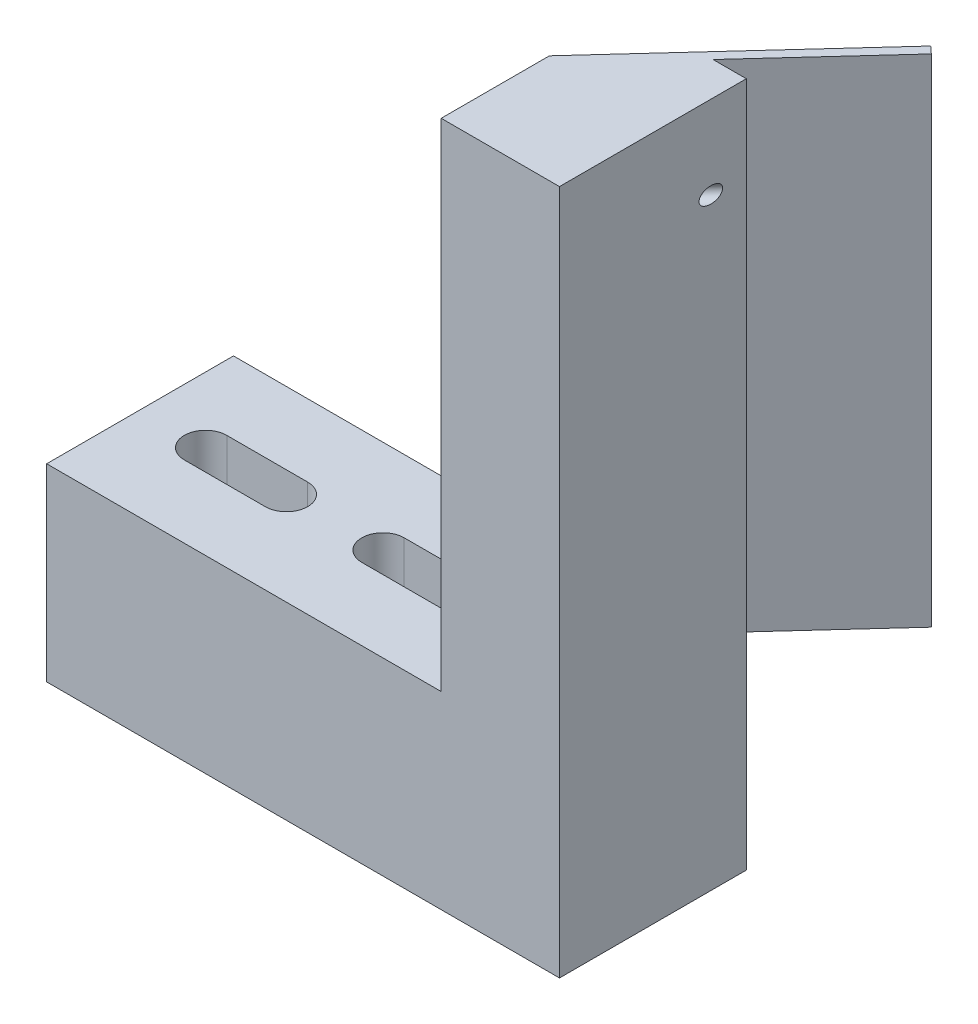
ISO-10303-21;
HEADER;
FILE_DESCRIPTION(('STEP AP214'),'2;1');
FILE_NAME('part.step','',(''),(''),'','','');
FILE_SCHEMA(('AUTOMOTIVE_DESIGN { 1 0 10303 214 1 1 1 1 }'));
ENDSEC;
DATA;
#1=APPLICATION_CONTEXT('core data for automotive mechanical design processes');
#2=APPLICATION_PROTOCOL_DEFINITION('international standard','automotive_design',2000,#1);
#3=PRODUCT_CONTEXT('',#1,'mechanical');
#4=PRODUCT('Part','Part','',(#3));
#5=PRODUCT_RELATED_PRODUCT_CATEGORY('part','',(#4));
#6=PRODUCT_DEFINITION_FORMATION('','',#4);
#7=PRODUCT_DEFINITION_CONTEXT('part definition',#1,'design');
#8=PRODUCT_DEFINITION('design','',#6,#7);
#9=PRODUCT_DEFINITION_SHAPE('','',#8);
#10=(LENGTH_UNIT() NAMED_UNIT(*) SI_UNIT(.MILLI.,.METRE.));
#11=(NAMED_UNIT(*) PLANE_ANGLE_UNIT() SI_UNIT($,.RADIAN.));
#12=(NAMED_UNIT(*) SI_UNIT($,.STERADIAN.) SOLID_ANGLE_UNIT());
#13=UNCERTAINTY_MEASURE_WITH_UNIT(LENGTH_MEASURE(1.E-05),#10,'distance_accuracy_value','');
#14=(GEOMETRIC_REPRESENTATION_CONTEXT(3) GLOBAL_UNCERTAINTY_ASSIGNED_CONTEXT((#13)) GLOBAL_UNIT_ASSIGNED_CONTEXT((#10,
#11,#12)) REPRESENTATION_CONTEXT('',''));
#15=CARTESIAN_POINT('',(0.,0.,0.));
#16=DIRECTION('',(0.,0.,1.));
#17=DIRECTION('',(1.,0.,0.));
#18=AXIS2_PLACEMENT_3D('',#15,#16,#17);
#19=CARTESIAN_POINT('',(0.,17.78,-17.579999892));
#20=DIRECTION('',(0.,1.,0.));
#21=DIRECTION('',(0.,0.,1.));
#22=AXIS2_PLACEMENT_3D('',#19,#20,#21);
#23=PLANE('',#22);
#24=CARTESIAN_POINT('',(30.48,17.78,-8.78900000000001));
#25=DIRECTION('',(0.,1.,0.));
#26=DIRECTION('',(0.,0.,1.));
#27=AXIS2_PLACEMENT_3D('',#24,#25,#26);
#28=CIRCLE('',#27,2.);
#29=CARTESIAN_POINT('',(30.48,17.78,-6.78900000000001));
#30=VERTEX_POINT('',#29);
#31=CARTESIAN_POINT('',(30.48,17.78,-10.789));
#32=VERTEX_POINT('',#31);
#33=EDGE_CURVE('E54',#30,#32,#28,.T.);
#34=ORIENTED_EDGE('',*,*,#33,.F.);
#35=DIRECTION('',(1.,0.,0.));
#36=VECTOR('',#35,1.);
#37=CARTESIAN_POINT('',(30.48,17.78,-6.78900000000001));
#38=LINE('',#37,#36);
#39=CARTESIAN_POINT('',(22.86,17.78,-6.78900000000001));
#40=VERTEX_POINT('',#39);
#41=EDGE_CURVE('E202',#40,#30,#38,.T.);
#42=ORIENTED_EDGE('',*,*,#41,.F.);
#43=CARTESIAN_POINT('',(22.86,17.78,-8.78900000000001));
#44=DIRECTION('',(0.,1.,0.));
#45=DIRECTION('',(0.,0.,1.));
#46=AXIS2_PLACEMENT_3D('',#43,#44,#45);
#47=CIRCLE('',#46,2.);
#48=CARTESIAN_POINT('',(22.86,17.78,-10.789));
#49=VERTEX_POINT('',#48);
#50=EDGE_CURVE('E217',#49,#40,#47,.T.);
#51=ORIENTED_EDGE('',*,*,#50,.F.);
#52=DIRECTION('',(-1.,0.,0.));
#53=VECTOR('',#52,1.);
#54=CARTESIAN_POINT('',(30.48,17.78,-10.789));
#55=LINE('',#54,#53);
#56=EDGE_CURVE('E213',#32,#49,#55,.T.);
#57=ORIENTED_EDGE('',*,*,#56,.F.);
#58=EDGE_LOOP('',(#34,#42,#51,#57));
#59=FACE_BOUND('',#58,.T.);
#60=CARTESIAN_POINT('',(13.78,17.78,-8.78900000000001));
#61=DIRECTION('',(0.,1.,0.));
#62=DIRECTION('',(0.,0.,1.));
#63=AXIS2_PLACEMENT_3D('',#60,#61,#62);
#64=CIRCLE('',#63,2.);
#65=CARTESIAN_POINT('',(13.7799999999999,17.78,-6.78900000000001));
#66=VERTEX_POINT('',#65);
#67=CARTESIAN_POINT('',(13.78,17.78,-10.789));
#68=VERTEX_POINT('',#67);
#69=EDGE_CURVE('E62',#66,#68,#64,.T.);
#70=ORIENTED_EDGE('',*,*,#69,.F.);
#71=DIRECTION('',(1.,0.,0.));
#72=VECTOR('',#71,1.);
#73=CARTESIAN_POINT('',(13.7799999999999,17.78,-6.78900000000001));
#74=LINE('',#73,#72);
#75=CARTESIAN_POINT('',(6.15999999999995,17.78,-6.78900000000001));
#76=VERTEX_POINT('',#75);
#77=EDGE_CURVE('E234',#76,#66,#74,.T.);
#78=ORIENTED_EDGE('',*,*,#77,.F.);
#79=CARTESIAN_POINT('',(6.15999999999995,17.78,-8.78900000000001));
#80=DIRECTION('',(0.,1.,0.));
#81=DIRECTION('',(0.,0.,1.));
#82=AXIS2_PLACEMENT_3D('',#79,#80,#81);
#83=CIRCLE('',#82,2.);
#84=CARTESIAN_POINT('',(6.15999999999995,17.78,-10.789));
#85=VERTEX_POINT('',#84);
#86=EDGE_CURVE('E248',#85,#76,#83,.T.);
#87=ORIENTED_EDGE('',*,*,#86,.F.);
#88=DIRECTION('',(-1.,0.,0.));
#89=VECTOR('',#88,1.);
#90=CARTESIAN_POINT('',(13.78,17.78,-10.789));
#91=LINE('',#90,#89);
#92=EDGE_CURVE('E245',#68,#85,#91,.T.);
#93=ORIENTED_EDGE('',*,*,#92,.F.);
#94=EDGE_LOOP('',(#70,#78,#87,#93));
#95=FACE_BOUND('',#94,.T.);
#96=DIRECTION('',(0.,0.,1.));
#97=VECTOR('',#96,1.);
#98=CARTESIAN_POINT('',(37.1284462662509,17.78,0.));
#99=LINE('',#98,#97);
#100=CARTESIAN_POINT('',(37.1284462662509,17.78,-10.1815563463158));
#101=VERTEX_POINT('',#100);
#102=CARTESIAN_POINT('',(37.1284462662508,17.78,0.));
#103=VERTEX_POINT('',#102);
#104=EDGE_CURVE('E224',#101,#103,#99,.T.);
#105=ORIENTED_EDGE('',*,*,#104,.F.);
#106=DIRECTION('',(-0.674918514079812,0.,0.737892268120691));
#107=VECTOR('',#106,1.);
#108=CARTESIAN_POINT('',(15.1452923349927,17.78,13.8527514647514));
#109=LINE('',#108,#107);
#110=CARTESIAN_POINT('',(43.8954863073044,17.78,-17.579999892));
#111=VERTEX_POINT('',#110);
#112=EDGE_CURVE('E194',#111,#101,#109,.T.);
#113=ORIENTED_EDGE('',*,*,#112,.F.);
#114=DIRECTION('',(-1.,0.,0.));
#115=VECTOR('',#114,1.);
#116=CARTESIAN_POINT('',(0.,17.78,-17.579999892));
#117=LINE('',#116,#115);
#118=CARTESIAN_POINT('',(0.,17.78,-17.579999892));
#119=VERTEX_POINT('',#118);
#120=EDGE_CURVE('E287',#111,#119,#117,.T.);
#121=ORIENTED_EDGE('',*,*,#120,.T.);
#122=DIRECTION('',(0.,0.,1.));
#123=VECTOR('',#122,1.);
#124=CARTESIAN_POINT('',(0.,17.78,-17.579999892));
#125=LINE('',#124,#123);
#126=CARTESIAN_POINT('',(0.,17.78,0.));
#127=VERTEX_POINT('',#126);
#128=EDGE_CURVE('E11',#119,#127,#125,.T.);
#129=ORIENTED_EDGE('',*,*,#128,.T.);
#130=DIRECTION('',(-1.,0.,0.));
#131=VECTOR('',#130,1.);
#132=CARTESIAN_POINT('',(0.,17.78,0.));
#133=LINE('',#132,#131);
#134=EDGE_CURVE('E282',#103,#127,#133,.T.);
#135=ORIENTED_EDGE('',*,*,#134,.F.);
#136=EDGE_LOOP('',(#105,#113,#121,#129,#135));
#137=FACE_BOUND('',#136,.T.);
#138=ADVANCED_FACE('F37',(#59,#95,#137),#23,.T.);
#139=CARTESIAN_POINT('',(0.,0.,-17.579999892));
#140=DIRECTION('',(-1.,0.,0.));
#141=DIRECTION('',(0.,0.,1.));
#142=AXIS2_PLACEMENT_3D('',#139,#140,#141);
#143=PLANE('',#142);
#144=DIRECTION('',(0.,-1.,0.));
#145=VECTOR('',#144,1.);
#146=CARTESIAN_POINT('',(0.,0.,0.));
#147=LINE('',#146,#145);
#148=CARTESIAN_POINT('',(0.,0.,0.));
#149=VERTEX_POINT('',#148);
#150=EDGE_CURVE('E277',#127,#149,#147,.T.);
#151=ORIENTED_EDGE('',*,*,#150,.F.);
#152=ORIENTED_EDGE('',*,*,#128,.F.);
#153=DIRECTION('',(0.,-1.,0.));
#154=VECTOR('',#153,1.);
#155=CARTESIAN_POINT('',(0.,0.,-17.579999892));
#156=LINE('',#155,#154);
#157=CARTESIAN_POINT('',(0.,0.,-17.579999892));
#158=VERTEX_POINT('',#157);
#159=EDGE_CURVE('E278',#119,#158,#156,.T.);
#160=ORIENTED_EDGE('',*,*,#159,.T.);
#161=DIRECTION('',(0.,0.,1.));
#162=VECTOR('',#161,1.);
#163=CARTESIAN_POINT('',(0.,0.,-17.579999892));
#164=LINE('',#163,#162);
#165=EDGE_CURVE('E290',#158,#149,#164,.T.);
#166=ORIENTED_EDGE('',*,*,#165,.T.);
#167=EDGE_LOOP('',(#151,#152,#160,#166));
#168=FACE_BOUND('',#167,.T.);
#169=ADVANCED_FACE('F39',(#168),#143,.T.);
#170=CARTESIAN_POINT('',(48.26,0.,-17.579999892));
#171=DIRECTION('',(1.,0.,0.));
#172=DIRECTION('',(0.,0.,-1.));
#173=AXIS2_PLACEMENT_3D('',#170,#171,#172);
#174=PLANE('',#173);
#175=CARTESIAN_POINT('',(48.26,56.699990232,-14.2422872080402));
#176=DIRECTION('',(1.,0.,0.));
#177=DIRECTION('',(0.,0.,1.));
#178=AXIS2_PLACEMENT_3D('',#175,#176,#177);
#179=ELLIPSE('',#178,1.11124526050756,0.749999999999997);
#180=CARTESIAN_POINT('',(48.26,56.699990232,-13.1310419475326));
#181=VERTEX_POINT('',#180);
#182=EDGE_CURVE('E41',#181,#181,#179,.T.);
#183=ORIENTED_EDGE('',*,*,#182,.F.);
#184=EDGE_LOOP('',(#183));
#185=FACE_BOUND('',#184,.T.);
#186=DIRECTION('',(0.,1.,0.));
#187=VECTOR('',#186,1.);
#188=CARTESIAN_POINT('',(48.26,0.,0.));
#189=LINE('',#188,#187);
#190=CARTESIAN_POINT('',(48.26,0.,0.));
#191=VERTEX_POINT('',#190);
#192=CARTESIAN_POINT('',(48.26,64.500000032,0.));
#193=VERTEX_POINT('',#192);
#194=EDGE_CURVE('E296',#191,#193,#189,.T.);
#195=ORIENTED_EDGE('',*,*,#194,.F.);
#196=DIRECTION('',(0.,0.,1.));
#197=VECTOR('',#196,1.);
#198=CARTESIAN_POINT('',(48.26,0.,-17.579999892));
#199=LINE('',#198,#197);
#200=CARTESIAN_POINT('',(48.26,0.,-17.579999892));
#201=VERTEX_POINT('',#200);
#202=EDGE_CURVE('E46',#201,#191,#199,.T.);
#203=ORIENTED_EDGE('',*,*,#202,.F.);
#204=DIRECTION('',(0.,1.,0.));
#205=VECTOR('',#204,1.);
#206=CARTESIAN_POINT('',(48.26,0.,-17.579999892));
#207=LINE('',#206,#205);
#208=CARTESIAN_POINT('',(48.26,64.500000032,-17.579999892));
#209=VERTEX_POINT('',#208);
#210=EDGE_CURVE('E285',#201,#209,#207,.T.);
#211=ORIENTED_EDGE('',*,*,#210,.T.);
#212=DIRECTION('',(0.,0.,-1.));
#213=VECTOR('',#212,1.);
#214=CARTESIAN_POINT('',(48.26,64.500000032,0.));
#215=LINE('',#214,#213);
#216=EDGE_CURVE('E265',#193,#209,#215,.T.);
#217=ORIENTED_EDGE('',*,*,#216,.F.);
#218=EDGE_LOOP('',(#195,#203,#211,#217));
#219=FACE_BOUND('',#218,.T.);
#220=ADVANCED_FACE('F322',(#185,#219),#174,.T.);
#221=CARTESIAN_POINT('',(0.,0.,-17.579999892));
#222=DIRECTION('',(0.,-1.,0.));
#223=DIRECTION('',(0.,0.,-1.));
#224=AXIS2_PLACEMENT_3D('',#221,#222,#223);
#225=PLANE('',#224);
#226=CARTESIAN_POINT('',(30.48,0.,-8.78900000000001));
#227=DIRECTION('',(0.,1.,0.));
#228=DIRECTION('',(0.,0.,1.));
#229=AXIS2_PLACEMENT_3D('',#226,#227,#228);
#230=CIRCLE('',#229,2.);
#231=CARTESIAN_POINT('',(30.48,0.,-6.78900000000001));
#232=VERTEX_POINT('',#231);
#233=CARTESIAN_POINT('',(30.48,0.,-10.789));
#234=VERTEX_POINT('',#233);
#235=EDGE_CURVE('E198',#232,#234,#230,.T.);
#236=ORIENTED_EDGE('',*,*,#235,.T.);
#237=DIRECTION('',(-1.,0.,0.));
#238=VECTOR('',#237,1.);
#239=CARTESIAN_POINT('',(30.48,0.,-10.789));
#240=LINE('',#239,#238);
#241=CARTESIAN_POINT('',(22.86,0.,-10.789));
#242=VERTEX_POINT('',#241);
#243=EDGE_CURVE('E201',#234,#242,#240,.T.);
#244=ORIENTED_EDGE('',*,*,#243,.T.);
#245=CARTESIAN_POINT('',(22.86,0.,-8.78900000000001));
#246=DIRECTION('',(0.,1.,0.));
#247=DIRECTION('',(0.,0.,1.));
#248=AXIS2_PLACEMENT_3D('',#245,#246,#247);
#249=CIRCLE('',#248,2.);
#250=CARTESIAN_POINT('',(22.86,0.,-6.78900000000001));
#251=VERTEX_POINT('',#250);
#252=EDGE_CURVE('E205',#242,#251,#249,.T.);
#253=ORIENTED_EDGE('',*,*,#252,.T.);
#254=DIRECTION('',(1.,0.,0.));
#255=VECTOR('',#254,1.);
#256=CARTESIAN_POINT('',(30.48,0.,-6.78900000000001));
#257=LINE('',#256,#255);
#258=EDGE_CURVE('E208',#251,#232,#257,.T.);
#259=ORIENTED_EDGE('',*,*,#258,.T.);
#260=EDGE_LOOP('',(#236,#244,#253,#259));
#261=FACE_BOUND('',#260,.T.);
#262=CARTESIAN_POINT('',(13.78,0.,-8.78900000000001));
#263=DIRECTION('',(0.,1.,0.));
#264=DIRECTION('',(0.,0.,1.));
#265=AXIS2_PLACEMENT_3D('',#262,#263,#264);
#266=CIRCLE('',#265,2.);
#267=CARTESIAN_POINT('',(13.7799999999999,0.,-6.78900000000001));
#268=VERTEX_POINT('',#267);
#269=CARTESIAN_POINT('',(13.78,0.,-10.789));
#270=VERTEX_POINT('',#269);
#271=EDGE_CURVE('E230',#268,#270,#266,.T.);
#272=ORIENTED_EDGE('',*,*,#271,.T.);
#273=DIRECTION('',(-1.,0.,0.));
#274=VECTOR('',#273,1.);
#275=CARTESIAN_POINT('',(13.78,0.,-10.789));
#276=LINE('',#275,#274);
#277=CARTESIAN_POINT('',(6.15999999999995,0.,-10.789));
#278=VERTEX_POINT('',#277);
#279=EDGE_CURVE('E233',#270,#278,#276,.T.);
#280=ORIENTED_EDGE('',*,*,#279,.T.);
#281=CARTESIAN_POINT('',(6.15999999999995,0.,-8.78900000000001));
#282=DIRECTION('',(0.,1.,0.));
#283=DIRECTION('',(0.,0.,1.));
#284=AXIS2_PLACEMENT_3D('',#281,#282,#283);
#285=CIRCLE('',#284,2.);
#286=CARTESIAN_POINT('',(6.15999999999995,0.,-6.78900000000001));
#287=VERTEX_POINT('',#286);
#288=EDGE_CURVE('E237',#278,#287,#285,.T.);
#289=ORIENTED_EDGE('',*,*,#288,.T.);
#290=DIRECTION('',(1.,0.,0.));
#291=VECTOR('',#290,1.);
#292=CARTESIAN_POINT('',(13.7799999999999,0.,-6.78900000000001));
#293=LINE('',#292,#291);
#294=EDGE_CURVE('E240',#287,#268,#293,.T.);
#295=ORIENTED_EDGE('',*,*,#294,.T.);
#296=EDGE_LOOP('',(#272,#280,#289,#295));
#297=FACE_BOUND('',#296,.T.);
#298=DIRECTION('',(1.,0.,0.));
#299=VECTOR('',#298,1.);
#300=CARTESIAN_POINT('',(0.,0.,0.));
#301=LINE('',#300,#299);
#302=EDGE_CURVE('E293',#149,#191,#301,.T.);
#303=ORIENTED_EDGE('',*,*,#302,.F.);
#304=ORIENTED_EDGE('',*,*,#165,.F.);
#305=DIRECTION('',(1.,0.,0.));
#306=VECTOR('',#305,1.);
#307=CARTESIAN_POINT('',(0.,0.,-17.579999892));
#308=LINE('',#307,#306);
#309=EDGE_CURVE('E281',#158,#201,#308,.T.);
#310=ORIENTED_EDGE('',*,*,#309,.T.);
#311=ORIENTED_EDGE('',*,*,#202,.T.);
#312=EDGE_LOOP('',(#303,#304,#310,#311));
#313=FACE_BOUND('',#312,.T.);
#314=ADVANCED_FACE('F306',(#261,#297,#313),#225,.T.);
#315=CARTESIAN_POINT('',(0.,0.,-17.579999892));
#316=DIRECTION('',(0.,0.,-1.));
#317=DIRECTION('',(-1.,0.,0.));
#318=AXIS2_PLACEMENT_3D('',#315,#316,#317);
#319=PLANE('',#318);
#320=ORIENTED_EDGE('',*,*,#159,.F.);
#321=ORIENTED_EDGE('',*,*,#120,.F.);
#322=CARTESIAN_POINT('',(45.1321099167701,17.78,-17.579999892));
#323=VERTEX_POINT('',#322);
#324=EDGE_CURVE('E288',#323,#111,#117,.T.);
#325=ORIENTED_EDGE('',*,*,#324,.F.);
#326=DIRECTION('',(0.,-1.,0.));
#327=VECTOR('',#326,1.);
#328=CARTESIAN_POINT('',(45.1321099167701,64.500000032,-17.579999892));
#329=LINE('',#328,#327);
#330=CARTESIAN_POINT('',(45.1321099167701,64.500000032,-17.579999892));
#331=VERTEX_POINT('',#330);
#332=EDGE_CURVE('E275',#331,#323,#329,.T.);
#333=ORIENTED_EDGE('',*,*,#332,.F.);
#334=DIRECTION('',(-1.,0.,0.));
#335=VECTOR('',#334,1.);
#336=CARTESIAN_POINT('',(0.,64.500000032,-17.579999892));
#337=LINE('',#336,#335);
#338=EDGE_CURVE('E180',#209,#331,#337,.T.);
#339=ORIENTED_EDGE('',*,*,#338,.F.);
#340=ORIENTED_EDGE('',*,*,#210,.F.);
#341=ORIENTED_EDGE('',*,*,#309,.F.);
#342=EDGE_LOOP('',(#320,#321,#325,#333,#339,#340,#341));
#343=FACE_BOUND('',#342,.T.);
#344=ADVANCED_FACE('F317',(#343),#319,.T.);
#345=CARTESIAN_POINT('',(0.,0.,0.));
#346=DIRECTION('',(0.,0.,-1.));
#347=DIRECTION('',(-1.,0.,0.));
#348=AXIS2_PLACEMENT_3D('',#345,#346,#347);
#349=PLANE('',#348);
#350=ORIENTED_EDGE('',*,*,#150,.T.);
#351=ORIENTED_EDGE('',*,*,#302,.T.);
#352=ORIENTED_EDGE('',*,*,#194,.T.);
#353=DIRECTION('',(1.,0.,0.));
#354=VECTOR('',#353,1.);
#355=CARTESIAN_POINT('',(0.,64.500000032,0.));
#356=LINE('',#355,#354);
#357=CARTESIAN_POINT('',(37.1284462662508,64.500000032,0.));
#358=VERTEX_POINT('',#357);
#359=EDGE_CURVE('E262',#358,#193,#356,.T.);
#360=ORIENTED_EDGE('',*,*,#359,.F.);
#361=DIRECTION('',(0.,-1.,0.));
#362=VECTOR('',#361,1.);
#363=CARTESIAN_POINT('',(37.1284462662508,64.500000032,0.));
#364=LINE('',#363,#362);
#365=EDGE_CURVE('E267',#358,#103,#364,.T.);
#366=ORIENTED_EDGE('',*,*,#365,.T.);
#367=ORIENTED_EDGE('',*,*,#134,.T.);
#368=EDGE_LOOP('',(#350,#351,#352,#360,#366,#367));
#369=FACE_BOUND('',#368,.T.);
#370=ADVANCED_FACE('F309',(#369),#349,.F.);
#371=CARTESIAN_POINT('',(37.1284462662508,64.500000032,0.));
#372=DIRECTION('',(1.,0.,0.));
#373=DIRECTION('',(0.,1.,0.));
#374=AXIS2_PLACEMENT_3D('',#371,#372,#373);
#375=PLANE('',#374);
#376=ORIENTED_EDGE('',*,*,#104,.T.);
#377=ORIENTED_EDGE('',*,*,#365,.F.);
#378=DIRECTION('',(0.,0.,1.));
#379=VECTOR('',#378,1.);
#380=CARTESIAN_POINT('',(37.1284462662508,64.500000032,0.));
#381=LINE('',#380,#379);
#382=CARTESIAN_POINT('',(37.1284462662508,64.500000032,-10.1815563463158));
#383=VERTEX_POINT('',#382);
#384=EDGE_CURVE('E260',#383,#358,#381,.T.);
#385=ORIENTED_EDGE('',*,*,#384,.F.);
#386=DIRECTION('',(0.,-1.,0.));
#387=VECTOR('',#386,1.);
#388=CARTESIAN_POINT('',(37.1284462662508,64.500000032,-10.1815563463158));
#389=LINE('',#388,#387);
#390=EDGE_CURVE('E272',#383,#101,#389,.T.);
#391=ORIENTED_EDGE('',*,*,#390,.T.);
#392=EDGE_LOOP('',(#376,#377,#385,#391));
#393=FACE_BOUND('',#392,.T.);
#394=ADVANCED_FACE('F325',(#393),#375,.F.);
#395=CARTESIAN_POINT('',(0.,64.500000032,0.));
#396=DIRECTION('',(0.,1.,0.));
#397=DIRECTION('',(-1.,0.,0.));
#398=AXIS2_PLACEMENT_3D('',#395,#396,#397);
#399=PLANE('',#398);
#400=ORIENTED_EDGE('',*,*,#338,.T.);
#401=DIRECTION('',(-0.674918514079799,0.,0.737892268120704));
#402=VECTOR('',#401,1.);
#403=CARTESIAN_POINT('',(15.8186153401926,64.500000032,14.4686112342571));
#404=LINE('',#403,#402);
#405=CARTESIAN_POINT('',(54.9446995290769,64.500000032,-28.3081601870761));
#406=VERTEX_POINT('',#405);
#407=EDGE_CURVE('E163',#406,#331,#404,.T.);
#408=ORIENTED_EDGE('',*,*,#407,.F.);
#409=DIRECTION('',(0.737892268120693,0.,0.674918514079811));
#410=VECTOR('',#409,1.);
#411=CARTESIAN_POINT('',(39.1260841888852,64.500000032,-42.7767714213329));
#412=LINE('',#411,#410);
#413=CARTESIAN_POINT('',(54.2713765238781,64.500000032,-28.9240199565814));
#414=VERTEX_POINT('',#413);
#415=EDGE_CURVE('E177',#414,#406,#412,.T.);
#416=ORIENTED_EDGE('',*,*,#415,.F.);
#417=DIRECTION('',(-0.674918514079812,0.,0.737892268120691));
#418=VECTOR('',#417,1.);
#419=CARTESIAN_POINT('',(15.1452923349927,64.500000032,13.8527514647514));
#420=LINE('',#419,#418);
#421=EDGE_CURVE('E186',#414,#383,#420,.T.);
#422=ORIENTED_EDGE('',*,*,#421,.T.);
#423=ORIENTED_EDGE('',*,*,#384,.T.);
#424=ORIENTED_EDGE('',*,*,#359,.T.);
#425=ORIENTED_EDGE('',*,*,#216,.T.);
#426=EDGE_LOOP('',(#400,#408,#416,#422,#423,#424,#425));
#427=FACE_BOUND('',#426,.T.);
#428=ADVANCED_FACE('F175',(#427),#399,.T.);
#429=CARTESIAN_POINT('',(13.78,0.,-8.78900000000001));
#430=DIRECTION('',(0.,1.,0.));
#431=DIRECTION('',(0.,0.,1.));
#432=AXIS2_PLACEMENT_3D('',#429,#430,#431);
#433=CYLINDRICAL_SURFACE('',#432,2.);
#434=ORIENTED_EDGE('',*,*,#69,.T.);
#435=DIRECTION('',(0.,1.,0.));
#436=VECTOR('',#435,1.);
#437=CARTESIAN_POINT('',(13.78,0.,-10.789));
#438=LINE('',#437,#436);
#439=EDGE_CURVE('E243',#270,#68,#438,.T.);
#440=ORIENTED_EDGE('',*,*,#439,.F.);
#441=ORIENTED_EDGE('',*,*,#271,.F.);
#442=DIRECTION('',(0.,1.,0.));
#443=VECTOR('',#442,1.);
#444=CARTESIAN_POINT('',(13.7799999999999,0.,-6.78900000000001));
#445=LINE('',#444,#443);
#446=EDGE_CURVE('E214',#268,#66,#445,.T.);
#447=ORIENTED_EDGE('',*,*,#446,.T.);
#448=EDGE_LOOP('',(#434,#440,#441,#447));
#449=FACE_BOUND('',#448,.T.);
#450=ADVANCED_FACE('F364',(#449),#433,.F.);
#451=CARTESIAN_POINT('',(13.7799999999999,0.,-6.78900000000001));
#452=DIRECTION('',(0.,0.,1.));
#453=DIRECTION('',(1.,0.,0.));
#454=AXIS2_PLACEMENT_3D('',#451,#452,#453);
#455=PLANE('',#454);
#456=ORIENTED_EDGE('',*,*,#77,.T.);
#457=ORIENTED_EDGE('',*,*,#446,.F.);
#458=ORIENTED_EDGE('',*,*,#294,.F.);
#459=DIRECTION('',(0.,1.,0.));
#460=VECTOR('',#459,1.);
#461=CARTESIAN_POINT('',(6.15999999999995,0.,-6.78900000000001));
#462=LINE('',#461,#460);
#463=EDGE_CURVE('E254',#287,#76,#462,.T.);
#464=ORIENTED_EDGE('',*,*,#463,.T.);
#465=EDGE_LOOP('',(#456,#457,#458,#464));
#466=FACE_BOUND('',#465,.T.);
#467=ADVANCED_FACE('F374',(#466),#455,.F.);
#468=CARTESIAN_POINT('',(6.15999999999995,0.,-8.78900000000001));
#469=DIRECTION('',(0.,1.,0.));
#470=DIRECTION('',(0.,0.,1.));
#471=AXIS2_PLACEMENT_3D('',#468,#469,#470);
#472=CYLINDRICAL_SURFACE('',#471,2.);
#473=ORIENTED_EDGE('',*,*,#86,.T.);
#474=ORIENTED_EDGE('',*,*,#463,.F.);
#475=ORIENTED_EDGE('',*,*,#288,.F.);
#476=DIRECTION('',(0.,1.,0.));
#477=VECTOR('',#476,1.);
#478=CARTESIAN_POINT('',(6.15999999999995,0.,-10.789));
#479=LINE('',#478,#477);
#480=EDGE_CURVE('E256',#278,#85,#479,.T.);
#481=ORIENTED_EDGE('',*,*,#480,.T.);
#482=EDGE_LOOP('',(#473,#474,#475,#481));
#483=FACE_BOUND('',#482,.T.);
#484=ADVANCED_FACE('F371',(#483),#472,.F.);
#485=CARTESIAN_POINT('',(13.78,0.,-10.789));
#486=DIRECTION('',(0.,0.,-1.));
#487=DIRECTION('',(-1.,0.,0.));
#488=AXIS2_PLACEMENT_3D('',#485,#486,#487);
#489=PLANE('',#488);
#490=ORIENTED_EDGE('',*,*,#92,.T.);
#491=ORIENTED_EDGE('',*,*,#480,.F.);
#492=ORIENTED_EDGE('',*,*,#279,.F.);
#493=ORIENTED_EDGE('',*,*,#439,.T.);
#494=EDGE_LOOP('',(#490,#491,#492,#493));
#495=FACE_BOUND('',#494,.T.);
#496=ADVANCED_FACE('F368',(#495),#489,.F.);
#497=CARTESIAN_POINT('',(30.48,0.,-8.78900000000001));
#498=DIRECTION('',(0.,1.,0.));
#499=DIRECTION('',(0.,0.,1.));
#500=AXIS2_PLACEMENT_3D('',#497,#498,#499);
#501=CYLINDRICAL_SURFACE('',#500,2.);
#502=ORIENTED_EDGE('',*,*,#33,.T.);
#503=DIRECTION('',(0.,1.,0.));
#504=VECTOR('',#503,1.);
#505=CARTESIAN_POINT('',(30.48,0.,-10.789));
#506=LINE('',#505,#504);
#507=EDGE_CURVE('E211',#234,#32,#506,.T.);
#508=ORIENTED_EDGE('',*,*,#507,.F.);
#509=ORIENTED_EDGE('',*,*,#235,.F.);
#510=DIRECTION('',(0.,1.,0.));
#511=VECTOR('',#510,1.);
#512=CARTESIAN_POINT('',(30.48,0.,-6.78900000000001));
#513=LINE('',#512,#511);
#514=EDGE_CURVE('E222',#232,#30,#513,.T.);
#515=ORIENTED_EDGE('',*,*,#514,.T.);
#516=EDGE_LOOP('',(#502,#508,#509,#515));
#517=FACE_BOUND('',#516,.T.);
#518=ADVANCED_FACE('F384',(#517),#501,.F.);
#519=CARTESIAN_POINT('',(30.48,0.,-6.78900000000001));
#520=DIRECTION('',(0.,0.,1.));
#521=DIRECTION('',(1.,0.,0.));
#522=AXIS2_PLACEMENT_3D('',#519,#520,#521);
#523=PLANE('',#522);
#524=ORIENTED_EDGE('',*,*,#41,.T.);
#525=ORIENTED_EDGE('',*,*,#514,.F.);
#526=ORIENTED_EDGE('',*,*,#258,.F.);
#527=DIRECTION('',(0.,1.,0.));
#528=VECTOR('',#527,1.);
#529=CARTESIAN_POINT('',(22.86,0.,-6.78900000000001));
#530=LINE('',#529,#528);
#531=EDGE_CURVE('E225',#251,#40,#530,.T.);
#532=ORIENTED_EDGE('',*,*,#531,.T.);
#533=EDGE_LOOP('',(#524,#525,#526,#532));
#534=FACE_BOUND('',#533,.T.);
#535=ADVANCED_FACE('F424',(#534),#523,.F.);
#536=CARTESIAN_POINT('',(22.86,0.,-8.78900000000001));
#537=DIRECTION('',(0.,1.,0.));
#538=DIRECTION('',(0.,0.,1.));
#539=AXIS2_PLACEMENT_3D('',#536,#537,#538);
#540=CYLINDRICAL_SURFACE('',#539,2.);
#541=ORIENTED_EDGE('',*,*,#50,.T.);
#542=ORIENTED_EDGE('',*,*,#531,.F.);
#543=ORIENTED_EDGE('',*,*,#252,.F.);
#544=DIRECTION('',(0.,1.,0.));
#545=VECTOR('',#544,1.);
#546=CARTESIAN_POINT('',(22.86,0.,-10.789));
#547=LINE('',#546,#545);
#548=EDGE_CURVE('E227',#242,#49,#547,.T.);
#549=ORIENTED_EDGE('',*,*,#548,.T.);
#550=EDGE_LOOP('',(#541,#542,#543,#549));
#551=FACE_BOUND('',#550,.T.);
#552=ADVANCED_FACE('F418',(#551),#540,.F.);
#553=CARTESIAN_POINT('',(30.48,0.,-10.789));
#554=DIRECTION('',(0.,0.,-1.));
#555=DIRECTION('',(-1.,0.,0.));
#556=AXIS2_PLACEMENT_3D('',#553,#554,#555);
#557=PLANE('',#556);
#558=ORIENTED_EDGE('',*,*,#56,.T.);
#559=ORIENTED_EDGE('',*,*,#548,.F.);
#560=ORIENTED_EDGE('',*,*,#243,.F.);
#561=ORIENTED_EDGE('',*,*,#507,.T.);
#562=EDGE_LOOP('',(#558,#559,#560,#561));
#563=FACE_BOUND('',#562,.T.);
#564=ADVANCED_FACE('F423',(#563),#557,.F.);
#565=CARTESIAN_POINT('',(15.8186153401926,64.500000032,14.4686112342571));
#566=DIRECTION('',(0.737892268120704,0.,0.674918514079799));
#567=DIRECTION('',(0.674918514079799,0.,-0.737892268120704));
#568=AXIS2_PLACEMENT_3D('',#565,#566,#567);
#569=PLANE('',#568);
#570=ORIENTED_EDGE('',*,*,#407,.T.);
#571=ORIENTED_EDGE('',*,*,#332,.T.);
#572=DIRECTION('',(-0.674918514079799,0.,0.737892268120704));
#573=VECTOR('',#572,1.);
#574=CARTESIAN_POINT('',(15.8186153401926,17.78,14.4686112342571));
#575=LINE('',#574,#573);
#576=CARTESIAN_POINT('',(54.9446995290769,17.78,-28.3081601870761));
#577=VERTEX_POINT('',#576);
#578=EDGE_CURVE('E166',#577,#323,#575,.T.);
#579=ORIENTED_EDGE('',*,*,#578,.F.);
#580=DIRECTION('',(0.,-1.,0.));
#581=VECTOR('',#580,1.);
#582=CARTESIAN_POINT('',(54.9446995290769,64.500000032,-28.3081601870761));
#583=LINE('',#582,#581);
#584=EDGE_CURVE('E160',#406,#577,#583,.T.);
#585=ORIENTED_EDGE('',*,*,#584,.F.);
#586=EDGE_LOOP('',(#570,#571,#579,#585));
#587=FACE_BOUND('',#586,.T.);
#588=ADVANCED_FACE('F162',(#587),#569,.T.);
#589=CARTESIAN_POINT('',(39.1260841888852,64.500000032,-42.7767714213329));
#590=DIRECTION('',(0.674918514079811,0.,-0.737892268120693));
#591=DIRECTION('',(-0.737892268120693,0.,-0.674918514079811));
#592=AXIS2_PLACEMENT_3D('',#589,#590,#591);
#593=PLANE('',#592);
#594=DIRECTION('',(0.737892268120693,0.,0.674918514079811));
#595=VECTOR('',#594,1.);
#596=CARTESIAN_POINT('',(39.1260841888852,17.78,-42.7767714213329));
#597=LINE('',#596,#595);
#598=CARTESIAN_POINT('',(54.2713765238781,17.78,-28.9240199565814));
#599=VERTEX_POINT('',#598);
#600=EDGE_CURVE('E192',#599,#577,#597,.T.);
#601=ORIENTED_EDGE('',*,*,#600,.F.);
#602=DIRECTION('',(0.,-1.,0.));
#603=VECTOR('',#602,1.);
#604=CARTESIAN_POINT('',(54.2713765238781,64.500000032,-28.9240199565814));
#605=LINE('',#604,#603);
#606=EDGE_CURVE('E171',#414,#599,#605,.T.);
#607=ORIENTED_EDGE('',*,*,#606,.F.);
#608=ORIENTED_EDGE('',*,*,#415,.T.);
#609=ORIENTED_EDGE('',*,*,#584,.T.);
#610=EDGE_LOOP('',(#601,#607,#608,#609));
#611=FACE_BOUND('',#610,.T.);
#612=ADVANCED_FACE('F184',(#611),#593,.T.);
#613=CARTESIAN_POINT('',(15.1452923349927,64.500000032,13.8527514647514));
#614=DIRECTION('',(0.737892268120691,0.,0.674918514079812));
#615=DIRECTION('',(0.674918514079812,0.,-0.737892268120691));
#616=AXIS2_PLACEMENT_3D('',#613,#614,#615);
#617=PLANE('',#616);
#618=EDGE_CURVE('E182',#599,#111,#109,.T.);
#619=ORIENTED_EDGE('',*,*,#618,.T.);
#620=ORIENTED_EDGE('',*,*,#112,.T.);
#621=ORIENTED_EDGE('',*,*,#390,.F.);
#622=ORIENTED_EDGE('',*,*,#421,.F.);
#623=ORIENTED_EDGE('',*,*,#606,.T.);
#624=EDGE_LOOP('',(#619,#620,#621,#622,#623));
#625=FACE_BOUND('',#624,.T.);
#626=ADVANCED_FACE('F327',(#625),#617,.F.);
#627=CARTESIAN_POINT('',(0.,17.78,0.));
#628=DIRECTION('',(0.,1.,0.));
#629=DIRECTION('',(-1.,0.,0.));
#630=AXIS2_PLACEMENT_3D('',#627,#628,#629);
#631=PLANE('',#630);
#632=ORIENTED_EDGE('',*,*,#324,.T.);
#633=ORIENTED_EDGE('',*,*,#618,.F.);
#634=ORIENTED_EDGE('',*,*,#600,.T.);
#635=ORIENTED_EDGE('',*,*,#578,.T.);
#636=EDGE_LOOP('',(#632,#633,#634,#635));
#637=FACE_BOUND('',#636,.T.);
#638=ADVANCED_FACE('F330',(#637),#631,.F.);
#639=CARTESIAN_POINT('',(41.1670966702929,57.449990232,-6.48757546679523));
#640=DIRECTION('',(-0.674918514079815,0.,0.737892268120689));
#641=DIRECTION('',(0.737892268120689,0.,0.674918514079815));
#642=AXIS2_PLACEMENT_3D('',#639,#640,#641);
#643=PLANE('',#642);
#644=CARTESIAN_POINT('',(41.1670966702929,56.699990232,-6.48757546679523));
#645=DIRECTION('',(-0.674918514079815,0.,0.737892268120689));
#646=DIRECTION('',(0.737892268120689,0.,0.674918514079815));
#647=AXIS2_PLACEMENT_3D('',#644,#645,#646);
#648=CIRCLE('',#647,0.750000000000001);
#649=CARTESIAN_POINT('',(41.7205158713834,56.699990232,-5.98138658123537));
#650=VERTEX_POINT('',#649);
#651=EDGE_CURVE('E500',#650,#650,#648,.T.);
#652=ORIENTED_EDGE('',*,*,#651,.F.);
#653=EDGE_LOOP('',(#652));
#654=FACE_BOUND('',#653,.T.);
#655=ADVANCED_FACE('F332',(#654),#643,.F.);
#656=CARTESIAN_POINT('',(41.1670966702929,56.699990232,-6.48757546679523));
#657=DIRECTION('',(-0.674918514079815,0.,0.737892268120689));
#658=DIRECTION('',(0.737892268120689,0.,0.674918514079815));
#659=AXIS2_PLACEMENT_3D('',#656,#657,#658);
#660=CYLINDRICAL_SURFACE('',#659,0.749999999999997);
#661=ORIENTED_EDGE('',*,*,#182,.T.);
#662=EDGE_LOOP('',(#661));
#663=FACE_BOUND('',#662,.T.);
#664=ORIENTED_EDGE('',*,*,#651,.T.);
#665=EDGE_LOOP('',(#664));
#666=FACE_BOUND('',#665,.T.);
#667=ADVANCED_FACE('F338',(#663,#666),#660,.F.);
#668=CLOSED_SHELL('',(#138,#169,#220,#314,#344,#370,#394,#428,#450,#467,#484,#496,#518,#535,
#552,#564,#588,#612,#626,#638,#655,#667));
#669=MANIFOLD_SOLID_BREP('B2',#668);
#670=ADVANCED_BREP_SHAPE_REPRESENTATION('',(#18,#669),#14);
#671=SHAPE_DEFINITION_REPRESENTATION(#9,#670);
ENDSEC;
END-ISO-10303-21;
